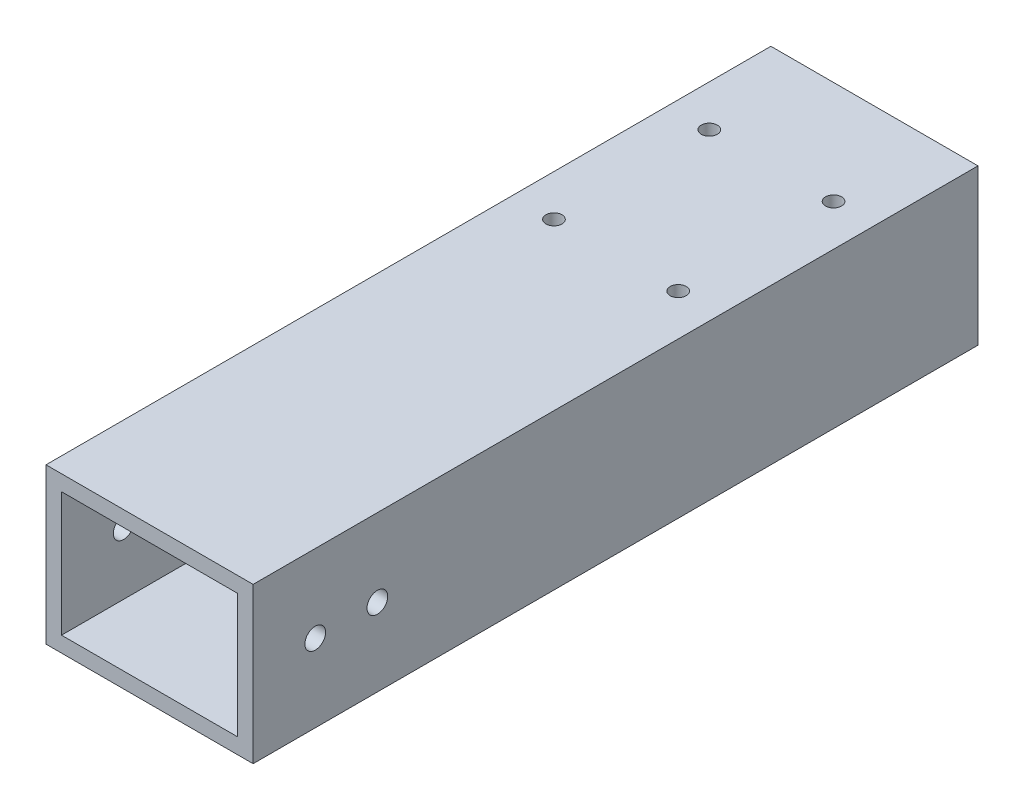
ISO-10303-21;
HEADER;
FILE_DESCRIPTION(('STEP AP214'),'2;1');
FILE_NAME('part.step','',(''),(''),'','','');
FILE_SCHEMA(('AUTOMOTIVE_DESIGN { 1 0 10303 214 1 1 1 1 }'));
ENDSEC;
DATA;
#1=APPLICATION_CONTEXT('core data for automotive mechanical design processes');
#2=APPLICATION_PROTOCOL_DEFINITION('international standard','automotive_design',2000,#1);
#3=PRODUCT_CONTEXT('',#1,'mechanical');
#4=PRODUCT('Part','Part','',(#3));
#5=PRODUCT_RELATED_PRODUCT_CATEGORY('part','',(#4));
#6=PRODUCT_DEFINITION_FORMATION('','',#4);
#7=PRODUCT_DEFINITION_CONTEXT('part definition',#1,'design');
#8=PRODUCT_DEFINITION('design','',#6,#7);
#9=PRODUCT_DEFINITION_SHAPE('','',#8);
#10=(LENGTH_UNIT() NAMED_UNIT(*) SI_UNIT(.MILLI.,.METRE.));
#11=(NAMED_UNIT(*) PLANE_ANGLE_UNIT() SI_UNIT($,.RADIAN.));
#12=(NAMED_UNIT(*) SI_UNIT($,.STERADIAN.) SOLID_ANGLE_UNIT());
#13=UNCERTAINTY_MEASURE_WITH_UNIT(LENGTH_MEASURE(1.E-05),#10,'distance_accuracy_value','');
#14=(GEOMETRIC_REPRESENTATION_CONTEXT(3) GLOBAL_UNCERTAINTY_ASSIGNED_CONTEXT((#13)) GLOBAL_UNIT_ASSIGNED_CONTEXT((#10,
#11,#12)) REPRESENTATION_CONTEXT('',''));
#15=CARTESIAN_POINT('',(0.,0.,0.));
#16=DIRECTION('',(0.,0.,1.));
#17=DIRECTION('',(1.,0.,0.));
#18=AXIS2_PLACEMENT_3D('',#15,#16,#17);
#19=CARTESIAN_POINT('',(0.,0.,140.));
#20=DIRECTION('',(0.,0.,-1.));
#21=DIRECTION('',(-1.,0.,0.));
#22=AXIS2_PLACEMENT_3D('',#19,#20,#21);
#23=PLANE('',#22);
#24=DIRECTION('',(0.,-1.,0.));
#25=VECTOR('',#24,1.);
#26=CARTESIAN_POINT('',(0.,0.,140.));
#27=LINE('',#26,#25);
#28=CARTESIAN_POINT('',(0.,30.,140.));
#29=VERTEX_POINT('',#28);
#30=CARTESIAN_POINT('',(0.,0.,140.));
#31=VERTEX_POINT('',#30);
#32=EDGE_CURVE('E139',#29,#31,#27,.T.);
#33=ORIENTED_EDGE('',*,*,#32,.T.);
#34=DIRECTION('',(1.,0.,0.));
#35=VECTOR('',#34,1.);
#36=CARTESIAN_POINT('',(0.,0.,140.));
#37=LINE('',#36,#35);
#38=CARTESIAN_POINT('',(40.,0.,140.));
#39=VERTEX_POINT('',#38);
#40=EDGE_CURVE('E142',#31,#39,#37,.T.);
#41=ORIENTED_EDGE('',*,*,#40,.T.);
#42=DIRECTION('',(0.,1.,0.));
#43=VECTOR('',#42,1.);
#44=CARTESIAN_POINT('',(40.,0.,140.));
#45=LINE('',#44,#43);
#46=CARTESIAN_POINT('',(40.,30.,140.));
#47=VERTEX_POINT('',#46);
#48=EDGE_CURVE('E145',#39,#47,#45,.T.);
#49=ORIENTED_EDGE('',*,*,#48,.T.);
#50=DIRECTION('',(-1.,0.,0.));
#51=VECTOR('',#50,1.);
#52=CARTESIAN_POINT('',(0.,30.,140.));
#53=LINE('',#52,#51);
#54=EDGE_CURVE('E147',#47,#29,#53,.T.);
#55=ORIENTED_EDGE('',*,*,#54,.T.);
#56=EDGE_LOOP('',(#33,#41,#49,#55));
#57=FACE_BOUND('',#56,.T.);
#58=DIRECTION('',(0.,-1.,0.));
#59=VECTOR('',#58,1.);
#60=CARTESIAN_POINT('',(3.,3.,140.));
#61=LINE('',#60,#59);
#62=CARTESIAN_POINT('',(3.,27.,140.));
#63=VERTEX_POINT('',#62);
#64=CARTESIAN_POINT('',(3.,3.,140.));
#65=VERTEX_POINT('',#64);
#66=EDGE_CURVE('E101',#63,#65,#61,.T.);
#67=ORIENTED_EDGE('',*,*,#66,.F.);
#68=DIRECTION('',(-1.,0.,0.));
#69=VECTOR('',#68,1.);
#70=CARTESIAN_POINT('',(3.,27.,140.));
#71=LINE('',#70,#69);
#72=CARTESIAN_POINT('',(37.,27.,140.));
#73=VERTEX_POINT('',#72);
#74=EDGE_CURVE('E123',#73,#63,#71,.T.);
#75=ORIENTED_EDGE('',*,*,#74,.F.);
#76=DIRECTION('',(0.,1.,0.));
#77=VECTOR('',#76,1.);
#78=CARTESIAN_POINT('',(37.,3.,140.));
#79=LINE('',#78,#77);
#80=CARTESIAN_POINT('',(37.,3.,140.));
#81=VERTEX_POINT('',#80);
#82=EDGE_CURVE('E121',#81,#73,#79,.T.);
#83=ORIENTED_EDGE('',*,*,#82,.F.);
#84=DIRECTION('',(1.,0.,0.));
#85=VECTOR('',#84,1.);
#86=CARTESIAN_POINT('',(3.,3.,140.));
#87=LINE('',#86,#85);
#88=EDGE_CURVE('E109',#65,#81,#87,.T.);
#89=ORIENTED_EDGE('',*,*,#88,.F.);
#90=EDGE_LOOP('',(#67,#75,#83,#89));
#91=FACE_BOUND('',#90,.T.);
#92=ADVANCED_FACE('F34',(#57,#91),#23,.F.);
#93=CARTESIAN_POINT('',(0.,0.,0.));
#94=DIRECTION('',(0.,0.,-1.));
#95=DIRECTION('',(-1.,0.,0.));
#96=AXIS2_PLACEMENT_3D('',#93,#94,#95);
#97=PLANE('',#96);
#98=DIRECTION('',(0.,-1.,0.));
#99=VECTOR('',#98,1.);
#100=CARTESIAN_POINT('',(0.,0.,0.));
#101=LINE('',#100,#99);
#102=CARTESIAN_POINT('',(0.,30.,0.));
#103=VERTEX_POINT('',#102);
#104=CARTESIAN_POINT('',(0.,0.,0.));
#105=VERTEX_POINT('',#104);
#106=EDGE_CURVE('E117',#103,#105,#101,.T.);
#107=ORIENTED_EDGE('',*,*,#106,.F.);
#108=DIRECTION('',(-1.,0.,0.));
#109=VECTOR('',#108,1.);
#110=CARTESIAN_POINT('',(0.,30.,0.));
#111=LINE('',#110,#109);
#112=CARTESIAN_POINT('',(40.,30.,0.));
#113=VERTEX_POINT('',#112);
#114=EDGE_CURVE('E143',#113,#103,#111,.T.);
#115=ORIENTED_EDGE('',*,*,#114,.F.);
#116=DIRECTION('',(0.,1.,0.));
#117=VECTOR('',#116,1.);
#118=CARTESIAN_POINT('',(40.,0.,0.));
#119=LINE('',#118,#117);
#120=CARTESIAN_POINT('',(40.,0.,0.));
#121=VERTEX_POINT('',#120);
#122=EDGE_CURVE('E154',#121,#113,#119,.T.);
#123=ORIENTED_EDGE('',*,*,#122,.F.);
#124=DIRECTION('',(1.,0.,0.));
#125=VECTOR('',#124,1.);
#126=CARTESIAN_POINT('',(0.,0.,0.));
#127=LINE('',#126,#125);
#128=EDGE_CURVE('E152',#105,#121,#127,.T.);
#129=ORIENTED_EDGE('',*,*,#128,.F.);
#130=EDGE_LOOP('',(#107,#115,#123,#129));
#131=FACE_BOUND('',#130,.T.);
#132=DIRECTION('',(-1.,0.,0.));
#133=VECTOR('',#132,1.);
#134=CARTESIAN_POINT('',(3.,27.,0.));
#135=LINE('',#134,#133);
#136=CARTESIAN_POINT('',(37.,27.,0.));
#137=VERTEX_POINT('',#136);
#138=CARTESIAN_POINT('',(3.,27.,0.));
#139=VERTEX_POINT('',#138);
#140=EDGE_CURVE('E110',#137,#139,#135,.T.);
#141=ORIENTED_EDGE('',*,*,#140,.T.);
#142=DIRECTION('',(0.,-1.,0.));
#143=VECTOR('',#142,1.);
#144=CARTESIAN_POINT('',(3.,3.,0.));
#145=LINE('',#144,#143);
#146=CARTESIAN_POINT('',(3.,3.,0.));
#147=VERTEX_POINT('',#146);
#148=EDGE_CURVE('E59',#139,#147,#145,.T.);
#149=ORIENTED_EDGE('',*,*,#148,.T.);
#150=DIRECTION('',(1.,0.,0.));
#151=VECTOR('',#150,1.);
#152=CARTESIAN_POINT('',(3.,3.,0.));
#153=LINE('',#152,#151);
#154=CARTESIAN_POINT('',(37.,3.,0.));
#155=VERTEX_POINT('',#154);
#156=EDGE_CURVE('E116',#147,#155,#153,.T.);
#157=ORIENTED_EDGE('',*,*,#156,.T.);
#158=DIRECTION('',(0.,1.,0.));
#159=VECTOR('',#158,1.);
#160=CARTESIAN_POINT('',(37.,3.,0.));
#161=LINE('',#160,#159);
#162=EDGE_CURVE('E131',#155,#137,#161,.T.);
#163=ORIENTED_EDGE('',*,*,#162,.T.);
#164=EDGE_LOOP('',(#141,#149,#157,#163));
#165=FACE_BOUND('',#164,.T.);
#166=ADVANCED_FACE('F226',(#131,#165),#97,.T.);
#167=CARTESIAN_POINT('',(0.,0.,140.));
#168=DIRECTION('',(1.,0.,0.));
#169=DIRECTION('',(0.,0.,-1.));
#170=AXIS2_PLACEMENT_3D('',#167,#168,#169);
#171=PLANE('',#170);
#172=CARTESIAN_POINT('',(0.,15.,116.));
#173=DIRECTION('',(1.,0.,0.));
#174=DIRECTION('',(0.,0.,-1.));
#175=AXIS2_PLACEMENT_3D('',#172,#173,#174);
#176=CIRCLE('',#175,2.);
#177=CARTESIAN_POINT('',(0.,15.,114.));
#178=VERTEX_POINT('',#177);
#179=EDGE_CURVE('E200',#178,#178,#176,.T.);
#180=ORIENTED_EDGE('',*,*,#179,.T.);
#181=EDGE_LOOP('',(#180));
#182=FACE_BOUND('',#181,.T.);
#183=CARTESIAN_POINT('',(0.,15.,128.));
#184=DIRECTION('',(1.,0.,0.));
#185=DIRECTION('',(0.,0.,-1.));
#186=AXIS2_PLACEMENT_3D('',#183,#184,#185);
#187=CIRCLE('',#186,2.);
#188=CARTESIAN_POINT('',(0.,15.,126.));
#189=VERTEX_POINT('',#188);
#190=EDGE_CURVE('E197',#189,#189,#187,.T.);
#191=ORIENTED_EDGE('',*,*,#190,.T.);
#192=EDGE_LOOP('',(#191));
#193=FACE_BOUND('',#192,.T.);
#194=ORIENTED_EDGE('',*,*,#106,.T.);
#195=DIRECTION('',(0.,0.,-1.));
#196=VECTOR('',#195,1.);
#197=CARTESIAN_POINT('',(0.,0.,140.));
#198=LINE('',#197,#196);
#199=EDGE_CURVE('E11',#31,#105,#198,.T.);
#200=ORIENTED_EDGE('',*,*,#199,.F.);
#201=ORIENTED_EDGE('',*,*,#32,.F.);
#202=DIRECTION('',(0.,0.,-1.));
#203=VECTOR('',#202,1.);
#204=CARTESIAN_POINT('',(0.,30.,140.));
#205=LINE('',#204,#203);
#206=EDGE_CURVE('E149',#29,#103,#205,.T.);
#207=ORIENTED_EDGE('',*,*,#206,.T.);
#208=EDGE_LOOP('',(#194,#200,#201,#207));
#209=FACE_BOUND('',#208,.T.);
#210=ADVANCED_FACE('F36',(#182,#193,#209),#171,.F.);
#211=CARTESIAN_POINT('',(0.,0.,140.));
#212=DIRECTION('',(0.,1.,0.));
#213=DIRECTION('',(0.,0.,1.));
#214=AXIS2_PLACEMENT_3D('',#211,#212,#213);
#215=PLANE('',#214);
#216=CARTESIAN_POINT('',(8.,0.,49.9));
#217=DIRECTION('',(0.,1.,0.));
#218=DIRECTION('',(0.,0.,-1.));
#219=AXIS2_PLACEMENT_3D('',#216,#217,#218);
#220=CIRCLE('',#219,1.55);
#221=CARTESIAN_POINT('',(8.,0.,48.35));
#222=VERTEX_POINT('',#221);
#223=EDGE_CURVE('E335',#222,#222,#220,.T.);
#224=ORIENTED_EDGE('',*,*,#223,.T.);
#225=EDGE_LOOP('',(#224));
#226=FACE_BOUND('',#225,.T.);
#227=CARTESIAN_POINT('',(32.,0.,49.9));
#228=DIRECTION('',(0.,1.,0.));
#229=DIRECTION('',(0.,0.,1.));
#230=AXIS2_PLACEMENT_3D('',#227,#228,#229);
#231=CIRCLE('',#230,1.55);
#232=CARTESIAN_POINT('',(32.,0.,51.45));
#233=VERTEX_POINT('',#232);
#234=EDGE_CURVE('E327',#233,#233,#231,.T.);
#235=ORIENTED_EDGE('',*,*,#234,.T.);
#236=EDGE_LOOP('',(#235));
#237=FACE_BOUND('',#236,.T.);
#238=CARTESIAN_POINT('',(32.,0.,19.9));
#239=DIRECTION('',(0.,1.,0.));
#240=DIRECTION('',(0.,0.,-1.));
#241=AXIS2_PLACEMENT_3D('',#238,#239,#240);
#242=CIRCLE('',#241,1.54999999999999);
#243=CARTESIAN_POINT('',(32.,0.,18.35));
#244=VERTEX_POINT('',#243);
#245=EDGE_CURVE('E318',#244,#244,#242,.T.);
#246=ORIENTED_EDGE('',*,*,#245,.T.);
#247=EDGE_LOOP('',(#246));
#248=FACE_BOUND('',#247,.T.);
#249=CARTESIAN_POINT('',(8.,0.,19.9));
#250=DIRECTION('',(0.,1.,0.));
#251=DIRECTION('',(0.,0.,1.));
#252=AXIS2_PLACEMENT_3D('',#249,#250,#251);
#253=CIRCLE('',#252,1.55);
#254=CARTESIAN_POINT('',(8.,0.,21.45));
#255=VERTEX_POINT('',#254);
#256=EDGE_CURVE('E324',#255,#255,#253,.T.);
#257=ORIENTED_EDGE('',*,*,#256,.T.);
#258=EDGE_LOOP('',(#257));
#259=FACE_BOUND('',#258,.T.);
#260=ORIENTED_EDGE('',*,*,#128,.T.);
#261=DIRECTION('',(0.,0.,-1.));
#262=VECTOR('',#261,1.);
#263=CARTESIAN_POINT('',(40.,0.,140.));
#264=LINE('',#263,#262);
#265=EDGE_CURVE('E43',#39,#121,#264,.T.);
#266=ORIENTED_EDGE('',*,*,#265,.F.);
#267=ORIENTED_EDGE('',*,*,#40,.F.);
#268=ORIENTED_EDGE('',*,*,#199,.T.);
#269=EDGE_LOOP('',(#260,#266,#267,#268));
#270=FACE_BOUND('',#269,.T.);
#271=ADVANCED_FACE('F225',(#226,#237,#248,#259,#270),#215,.F.);
#272=CARTESIAN_POINT('',(40.,0.,140.));
#273=DIRECTION('',(-1.,0.,0.));
#274=DIRECTION('',(0.,0.,1.));
#275=AXIS2_PLACEMENT_3D('',#272,#273,#274);
#276=PLANE('',#275);
#277=CARTESIAN_POINT('',(40.,15.,116.));
#278=DIRECTION('',(1.,0.,0.));
#279=DIRECTION('',(0.,0.,-1.));
#280=AXIS2_PLACEMENT_3D('',#277,#278,#279);
#281=CIRCLE('',#280,2.);
#282=CARTESIAN_POINT('',(40.,15.,114.));
#283=VERTEX_POINT('',#282);
#284=EDGE_CURVE('E168',#283,#283,#281,.T.);
#285=ORIENTED_EDGE('',*,*,#284,.F.);
#286=EDGE_LOOP('',(#285));
#287=FACE_BOUND('',#286,.T.);
#288=CARTESIAN_POINT('',(40.,15.,128.));
#289=DIRECTION('',(1.,0.,0.));
#290=DIRECTION('',(0.,0.,-1.));
#291=AXIS2_PLACEMENT_3D('',#288,#289,#290);
#292=CIRCLE('',#291,2.);
#293=CARTESIAN_POINT('',(40.,15.,126.));
#294=VERTEX_POINT('',#293);
#295=EDGE_CURVE('E203',#294,#294,#292,.T.);
#296=ORIENTED_EDGE('',*,*,#295,.F.);
#297=EDGE_LOOP('',(#296));
#298=FACE_BOUND('',#297,.T.);
#299=ORIENTED_EDGE('',*,*,#122,.T.);
#300=DIRECTION('',(0.,0.,-1.));
#301=VECTOR('',#300,1.);
#302=CARTESIAN_POINT('',(40.,30.,140.));
#303=LINE('',#302,#301);
#304=EDGE_CURVE('E159',#47,#113,#303,.T.);
#305=ORIENTED_EDGE('',*,*,#304,.F.);
#306=ORIENTED_EDGE('',*,*,#48,.F.);
#307=ORIENTED_EDGE('',*,*,#265,.T.);
#308=EDGE_LOOP('',(#299,#305,#306,#307));
#309=FACE_BOUND('',#308,.T.);
#310=ADVANCED_FACE('F246',(#287,#298,#309),#276,.F.);
#311=CARTESIAN_POINT('',(0.,30.,140.));
#312=DIRECTION('',(0.,-1.,0.));
#313=DIRECTION('',(0.,0.,-1.));
#314=AXIS2_PLACEMENT_3D('',#311,#312,#313);
#315=PLANE('',#314);
#316=CARTESIAN_POINT('',(8.,30.,49.9));
#317=DIRECTION('',(0.,1.,0.));
#318=DIRECTION('',(0.,0.,-1.));
#319=AXIS2_PLACEMENT_3D('',#316,#317,#318);
#320=CIRCLE('',#319,1.55);
#321=CARTESIAN_POINT('',(8.,30.,48.35));
#322=VERTEX_POINT('',#321);
#323=EDGE_CURVE('E332',#322,#322,#320,.T.);
#324=ORIENTED_EDGE('',*,*,#323,.F.);
#325=EDGE_LOOP('',(#324));
#326=FACE_BOUND('',#325,.T.);
#327=CARTESIAN_POINT('',(32.,30.,49.9));
#328=DIRECTION('',(0.,1.,0.));
#329=DIRECTION('',(0.,0.,1.));
#330=AXIS2_PLACEMENT_3D('',#327,#328,#329);
#331=CIRCLE('',#330,1.55);
#332=CARTESIAN_POINT('',(32.,30.,51.45));
#333=VERTEX_POINT('',#332);
#334=EDGE_CURVE('E321',#333,#333,#331,.T.);
#335=ORIENTED_EDGE('',*,*,#334,.F.);
#336=EDGE_LOOP('',(#335));
#337=FACE_BOUND('',#336,.T.);
#338=CARTESIAN_POINT('',(32.,30.,19.9));
#339=DIRECTION('',(0.,1.,0.));
#340=DIRECTION('',(0.,0.,-1.));
#341=AXIS2_PLACEMENT_3D('',#338,#339,#340);
#342=CIRCLE('',#341,1.54999999999999);
#343=CARTESIAN_POINT('',(32.,30.,18.35));
#344=VERTEX_POINT('',#343);
#345=EDGE_CURVE('E320',#344,#344,#342,.T.);
#346=ORIENTED_EDGE('',*,*,#345,.F.);
#347=EDGE_LOOP('',(#346));
#348=FACE_BOUND('',#347,.T.);
#349=CARTESIAN_POINT('',(8.,30.,19.9));
#350=DIRECTION('',(0.,1.,0.));
#351=DIRECTION('',(0.,0.,1.));
#352=AXIS2_PLACEMENT_3D('',#349,#350,#351);
#353=CIRCLE('',#352,1.55);
#354=CARTESIAN_POINT('',(8.,30.,21.45));
#355=VERTEX_POINT('',#354);
#356=EDGE_CURVE('E176',#355,#355,#353,.T.);
#357=ORIENTED_EDGE('',*,*,#356,.F.);
#358=EDGE_LOOP('',(#357));
#359=FACE_BOUND('',#358,.T.);
#360=ORIENTED_EDGE('',*,*,#114,.T.);
#361=ORIENTED_EDGE('',*,*,#206,.F.);
#362=ORIENTED_EDGE('',*,*,#54,.F.);
#363=ORIENTED_EDGE('',*,*,#304,.T.);
#364=EDGE_LOOP('',(#360,#361,#362,#363));
#365=FACE_BOUND('',#364,.T.);
#366=ADVANCED_FACE('F244',(#326,#337,#348,#359,#365),#315,.F.);
#367=CARTESIAN_POINT('',(3.,3.,140.));
#368=DIRECTION('',(1.,0.,0.));
#369=DIRECTION('',(0.,0.,-1.));
#370=AXIS2_PLACEMENT_3D('',#367,#368,#369);
#371=PLANE('',#370);
#372=CARTESIAN_POINT('',(3.,15.,116.));
#373=DIRECTION('',(1.,0.,0.));
#374=DIRECTION('',(0.,0.,-1.));
#375=AXIS2_PLACEMENT_3D('',#372,#373,#374);
#376=CIRCLE('',#375,2.);
#377=CARTESIAN_POINT('',(3.,15.,114.));
#378=VERTEX_POINT('',#377);
#379=EDGE_CURVE('E129',#378,#378,#376,.F.);
#380=ORIENTED_EDGE('',*,*,#379,.T.);
#381=EDGE_LOOP('',(#380));
#382=FACE_BOUND('',#381,.T.);
#383=CARTESIAN_POINT('',(3.,15.,128.));
#384=DIRECTION('',(1.,0.,0.));
#385=DIRECTION('',(0.,0.,-1.));
#386=AXIS2_PLACEMENT_3D('',#383,#384,#385);
#387=CIRCLE('',#386,2.);
#388=CARTESIAN_POINT('',(3.,15.,126.));
#389=VERTEX_POINT('',#388);
#390=EDGE_CURVE('E167',#389,#389,#387,.F.);
#391=ORIENTED_EDGE('',*,*,#390,.T.);
#392=EDGE_LOOP('',(#391));
#393=FACE_BOUND('',#392,.T.);
#394=ORIENTED_EDGE('',*,*,#148,.F.);
#395=DIRECTION('',(0.,0.,-1.));
#396=VECTOR('',#395,1.);
#397=CARTESIAN_POINT('',(3.,27.,140.));
#398=LINE('',#397,#396);
#399=EDGE_CURVE('E105',#63,#139,#398,.T.);
#400=ORIENTED_EDGE('',*,*,#399,.F.);
#401=ORIENTED_EDGE('',*,*,#66,.T.);
#402=DIRECTION('',(0.,0.,-1.));
#403=VECTOR('',#402,1.);
#404=CARTESIAN_POINT('',(3.,3.,140.));
#405=LINE('',#404,#403);
#406=EDGE_CURVE('E104',#65,#147,#405,.T.);
#407=ORIENTED_EDGE('',*,*,#406,.T.);
#408=EDGE_LOOP('',(#394,#400,#401,#407));
#409=FACE_BOUND('',#408,.T.);
#410=ADVANCED_FACE('F103',(#382,#393,#409),#371,.T.);
#411=CARTESIAN_POINT('',(3.,3.,140.));
#412=DIRECTION('',(0.,1.,0.));
#413=DIRECTION('',(0.,0.,1.));
#414=AXIS2_PLACEMENT_3D('',#411,#412,#413);
#415=PLANE('',#414);
#416=CARTESIAN_POINT('',(8.,3.,49.9));
#417=DIRECTION('',(0.,1.,0.));
#418=DIRECTION('',(0.,0.,1.));
#419=AXIS2_PLACEMENT_3D('',#416,#417,#418);
#420=CIRCLE('',#419,1.55);
#421=CARTESIAN_POINT('',(8.,3.,51.45));
#422=VERTEX_POINT('',#421);
#423=EDGE_CURVE('E194',#422,#422,#420,.F.);
#424=ORIENTED_EDGE('',*,*,#423,.T.);
#425=EDGE_LOOP('',(#424));
#426=FACE_BOUND('',#425,.T.);
#427=CARTESIAN_POINT('',(32.,3.,49.9));
#428=DIRECTION('',(0.,1.,0.));
#429=DIRECTION('',(0.,0.,1.));
#430=AXIS2_PLACEMENT_3D('',#427,#428,#429);
#431=CIRCLE('',#430,1.55);
#432=CARTESIAN_POINT('',(32.,3.,51.45));
#433=VERTEX_POINT('',#432);
#434=EDGE_CURVE('E182',#433,#433,#431,.F.);
#435=ORIENTED_EDGE('',*,*,#434,.T.);
#436=EDGE_LOOP('',(#435));
#437=FACE_BOUND('',#436,.T.);
#438=CARTESIAN_POINT('',(32.,3.,19.9));
#439=DIRECTION('',(0.,1.,0.));
#440=DIRECTION('',(0.,0.,1.));
#441=AXIS2_PLACEMENT_3D('',#438,#439,#440);
#442=CIRCLE('',#441,1.54999999999999);
#443=CARTESIAN_POINT('',(32.,3.,21.45));
#444=VERTEX_POINT('',#443);
#445=EDGE_CURVE('E179',#444,#444,#442,.F.);
#446=ORIENTED_EDGE('',*,*,#445,.T.);
#447=EDGE_LOOP('',(#446));
#448=FACE_BOUND('',#447,.T.);
#449=CARTESIAN_POINT('',(8.,3.,19.9));
#450=DIRECTION('',(0.,1.,0.));
#451=DIRECTION('',(0.,0.,1.));
#452=AXIS2_PLACEMENT_3D('',#449,#450,#451);
#453=CIRCLE('',#452,1.55);
#454=CARTESIAN_POINT('',(8.,3.,21.45));
#455=VERTEX_POINT('',#454);
#456=EDGE_CURVE('E175',#455,#455,#453,.F.);
#457=ORIENTED_EDGE('',*,*,#456,.T.);
#458=EDGE_LOOP('',(#457));
#459=FACE_BOUND('',#458,.T.);
#460=ORIENTED_EDGE('',*,*,#156,.F.);
#461=ORIENTED_EDGE('',*,*,#406,.F.);
#462=ORIENTED_EDGE('',*,*,#88,.T.);
#463=DIRECTION('',(0.,0.,-1.));
#464=VECTOR('',#463,1.);
#465=CARTESIAN_POINT('',(37.,3.,140.));
#466=LINE('',#465,#464);
#467=EDGE_CURVE('E118',#81,#155,#466,.T.);
#468=ORIENTED_EDGE('',*,*,#467,.T.);
#469=EDGE_LOOP('',(#460,#461,#462,#468));
#470=FACE_BOUND('',#469,.T.);
#471=ADVANCED_FACE('F113',(#426,#437,#448,#459,#470),#415,.T.);
#472=CARTESIAN_POINT('',(37.,3.,140.));
#473=DIRECTION('',(-1.,0.,0.));
#474=DIRECTION('',(0.,0.,1.));
#475=AXIS2_PLACEMENT_3D('',#472,#473,#474);
#476=PLANE('',#475);
#477=CARTESIAN_POINT('',(37.,15.,116.));
#478=DIRECTION('',(-1.,0.,0.));
#479=DIRECTION('',(0.,0.,1.));
#480=AXIS2_PLACEMENT_3D('',#477,#478,#479);
#481=CIRCLE('',#480,2.);
#482=CARTESIAN_POINT('',(37.,15.,118.));
#483=VERTEX_POINT('',#482);
#484=EDGE_CURVE('E169',#483,#483,#481,.F.);
#485=ORIENTED_EDGE('',*,*,#484,.T.);
#486=EDGE_LOOP('',(#485));
#487=FACE_BOUND('',#486,.T.);
#488=CARTESIAN_POINT('',(37.,15.,128.));
#489=DIRECTION('',(-1.,0.,0.));
#490=DIRECTION('',(0.,0.,1.));
#491=AXIS2_PLACEMENT_3D('',#488,#489,#490);
#492=CIRCLE('',#491,2.);
#493=CARTESIAN_POINT('',(37.,15.,130.));
#494=VERTEX_POINT('',#493);
#495=EDGE_CURVE('E164',#494,#494,#492,.F.);
#496=ORIENTED_EDGE('',*,*,#495,.T.);
#497=EDGE_LOOP('',(#496));
#498=FACE_BOUND('',#497,.T.);
#499=ORIENTED_EDGE('',*,*,#162,.F.);
#500=ORIENTED_EDGE('',*,*,#467,.F.);
#501=ORIENTED_EDGE('',*,*,#82,.T.);
#502=DIRECTION('',(0.,0.,-1.));
#503=VECTOR('',#502,1.);
#504=CARTESIAN_POINT('',(37.,27.,140.));
#505=LINE('',#504,#503);
#506=EDGE_CURVE('E51',#73,#137,#505,.T.);
#507=ORIENTED_EDGE('',*,*,#506,.T.);
#508=EDGE_LOOP('',(#499,#500,#501,#507));
#509=FACE_BOUND('',#508,.T.);
#510=ADVANCED_FACE('F270',(#487,#498,#509),#476,.T.);
#511=CARTESIAN_POINT('',(3.,27.,140.));
#512=DIRECTION('',(0.,-1.,0.));
#513=DIRECTION('',(0.,0.,-1.));
#514=AXIS2_PLACEMENT_3D('',#511,#512,#513);
#515=PLANE('',#514);
#516=CARTESIAN_POINT('',(8.,27.,49.9));
#517=DIRECTION('',(0.,-1.,0.));
#518=DIRECTION('',(0.,0.,-1.));
#519=AXIS2_PLACEMENT_3D('',#516,#517,#518);
#520=CIRCLE('',#519,1.55);
#521=CARTESIAN_POINT('',(8.,27.,48.35));
#522=VERTEX_POINT('',#521);
#523=EDGE_CURVE('E38',#522,#522,#520,.F.);
#524=ORIENTED_EDGE('',*,*,#523,.T.);
#525=EDGE_LOOP('',(#524));
#526=FACE_BOUND('',#525,.T.);
#527=CARTESIAN_POINT('',(32.,27.,49.9));
#528=DIRECTION('',(0.,-1.,0.));
#529=DIRECTION('',(0.,0.,-1.));
#530=AXIS2_PLACEMENT_3D('',#527,#528,#529);
#531=CIRCLE('',#530,1.55);
#532=CARTESIAN_POINT('',(32.,27.,48.35));
#533=VERTEX_POINT('',#532);
#534=EDGE_CURVE('E180',#533,#533,#531,.F.);
#535=ORIENTED_EDGE('',*,*,#534,.T.);
#536=EDGE_LOOP('',(#535));
#537=FACE_BOUND('',#536,.T.);
#538=CARTESIAN_POINT('',(32.,27.,19.9));
#539=DIRECTION('',(0.,-1.,0.));
#540=DIRECTION('',(0.,0.,-1.));
#541=AXIS2_PLACEMENT_3D('',#538,#539,#540);
#542=CIRCLE('',#541,1.54999999999999);
#543=CARTESIAN_POINT('',(32.,27.,18.35));
#544=VERTEX_POINT('',#543);
#545=EDGE_CURVE('E177',#544,#544,#542,.F.);
#546=ORIENTED_EDGE('',*,*,#545,.T.);
#547=EDGE_LOOP('',(#546));
#548=FACE_BOUND('',#547,.T.);
#549=CARTESIAN_POINT('',(8.,27.,19.9));
#550=DIRECTION('',(0.,-1.,0.));
#551=DIRECTION('',(0.,0.,-1.));
#552=AXIS2_PLACEMENT_3D('',#549,#550,#551);
#553=CIRCLE('',#552,1.55);
#554=CARTESIAN_POINT('',(8.,27.,18.35));
#555=VERTEX_POINT('',#554);
#556=EDGE_CURVE('E172',#555,#555,#553,.F.);
#557=ORIENTED_EDGE('',*,*,#556,.T.);
#558=EDGE_LOOP('',(#557));
#559=FACE_BOUND('',#558,.T.);
#560=ORIENTED_EDGE('',*,*,#140,.F.);
#561=ORIENTED_EDGE('',*,*,#506,.F.);
#562=ORIENTED_EDGE('',*,*,#74,.T.);
#563=ORIENTED_EDGE('',*,*,#399,.T.);
#564=EDGE_LOOP('',(#560,#561,#562,#563));
#565=FACE_BOUND('',#564,.T.);
#566=ADVANCED_FACE('F274',(#526,#537,#548,#559,#565),#515,.T.);
#567=CARTESIAN_POINT('',(40.,15.,128.));
#568=DIRECTION('',(-1.,0.,0.));
#569=DIRECTION('',(0.,0.,1.));
#570=AXIS2_PLACEMENT_3D('',#567,#568,#569);
#571=CYLINDRICAL_SURFACE('',#570,2.);
#572=ORIENTED_EDGE('',*,*,#495,.F.);
#573=EDGE_LOOP('',(#572));
#574=FACE_BOUND('',#573,.T.);
#575=ORIENTED_EDGE('',*,*,#295,.T.);
#576=EDGE_LOOP('',(#575));
#577=FACE_BOUND('',#576,.T.);
#578=ADVANCED_FACE('F278',(#574,#577),#571,.F.);
#579=CARTESIAN_POINT('',(40.,15.,116.));
#580=DIRECTION('',(-1.,0.,0.));
#581=DIRECTION('',(0.,0.,1.));
#582=AXIS2_PLACEMENT_3D('',#579,#580,#581);
#583=CYLINDRICAL_SURFACE('',#582,2.);
#584=ORIENTED_EDGE('',*,*,#484,.F.);
#585=EDGE_LOOP('',(#584));
#586=FACE_BOUND('',#585,.T.);
#587=ORIENTED_EDGE('',*,*,#284,.T.);
#588=EDGE_LOOP('',(#587));
#589=FACE_BOUND('',#588,.T.);
#590=ADVANCED_FACE('F220',(#586,#589),#583,.F.);
#591=ORIENTED_EDGE('',*,*,#390,.F.);
#592=EDGE_LOOP('',(#591));
#593=FACE_BOUND('',#592,.T.);
#594=ORIENTED_EDGE('',*,*,#190,.F.);
#595=EDGE_LOOP('',(#594));
#596=FACE_BOUND('',#595,.T.);
#597=ADVANCED_FACE('F218',(#593,#596),#571,.F.);
#598=ORIENTED_EDGE('',*,*,#379,.F.);
#599=EDGE_LOOP('',(#598));
#600=FACE_BOUND('',#599,.T.);
#601=ORIENTED_EDGE('',*,*,#179,.F.);
#602=EDGE_LOOP('',(#601));
#603=FACE_BOUND('',#602,.T.);
#604=ADVANCED_FACE('F214',(#600,#603),#583,.F.);
#605=CARTESIAN_POINT('',(8.,30.,19.9));
#606=DIRECTION('',(0.,-1.,0.));
#607=DIRECTION('',(0.,0.,-1.));
#608=AXIS2_PLACEMENT_3D('',#605,#606,#607);
#609=CYLINDRICAL_SURFACE('',#608,1.55);
#610=ORIENTED_EDGE('',*,*,#556,.F.);
#611=EDGE_LOOP('',(#610));
#612=FACE_BOUND('',#611,.T.);
#613=ORIENTED_EDGE('',*,*,#356,.T.);
#614=EDGE_LOOP('',(#613));
#615=FACE_BOUND('',#614,.T.);
#616=ADVANCED_FACE('F217',(#612,#615),#609,.F.);
#617=CARTESIAN_POINT('',(32.,30.,19.9));
#618=DIRECTION('',(0.,-1.,0.));
#619=DIRECTION('',(0.,0.,-1.));
#620=AXIS2_PLACEMENT_3D('',#617,#618,#619);
#621=CYLINDRICAL_SURFACE('',#620,1.54999999999999);
#622=ORIENTED_EDGE('',*,*,#545,.F.);
#623=EDGE_LOOP('',(#622));
#624=FACE_BOUND('',#623,.T.);
#625=ORIENTED_EDGE('',*,*,#345,.T.);
#626=EDGE_LOOP('',(#625));
#627=FACE_BOUND('',#626,.T.);
#628=ADVANCED_FACE('F287',(#624,#627),#621,.F.);
#629=CARTESIAN_POINT('',(32.,30.,49.9));
#630=DIRECTION('',(0.,-1.,0.));
#631=DIRECTION('',(0.,0.,-1.));
#632=AXIS2_PLACEMENT_3D('',#629,#630,#631);
#633=CYLINDRICAL_SURFACE('',#632,1.55);
#634=ORIENTED_EDGE('',*,*,#534,.F.);
#635=EDGE_LOOP('',(#634));
#636=FACE_BOUND('',#635,.T.);
#637=ORIENTED_EDGE('',*,*,#334,.T.);
#638=EDGE_LOOP('',(#637));
#639=FACE_BOUND('',#638,.T.);
#640=ADVANCED_FACE('F293',(#636,#639),#633,.F.);
#641=CARTESIAN_POINT('',(8.,30.,49.9));
#642=DIRECTION('',(0.,-1.,0.));
#643=DIRECTION('',(0.,0.,-1.));
#644=AXIS2_PLACEMENT_3D('',#641,#642,#643);
#645=CYLINDRICAL_SURFACE('',#644,1.55);
#646=ORIENTED_EDGE('',*,*,#523,.F.);
#647=EDGE_LOOP('',(#646));
#648=FACE_BOUND('',#647,.T.);
#649=ORIENTED_EDGE('',*,*,#323,.T.);
#650=EDGE_LOOP('',(#649));
#651=FACE_BOUND('',#650,.T.);
#652=ADVANCED_FACE('F290',(#648,#651),#645,.F.);
#653=ORIENTED_EDGE('',*,*,#456,.F.);
#654=EDGE_LOOP('',(#653));
#655=FACE_BOUND('',#654,.T.);
#656=ORIENTED_EDGE('',*,*,#256,.F.);
#657=EDGE_LOOP('',(#656));
#658=FACE_BOUND('',#657,.T.);
#659=ADVANCED_FACE('F289',(#655,#658),#609,.F.);
#660=ORIENTED_EDGE('',*,*,#445,.F.);
#661=EDGE_LOOP('',(#660));
#662=FACE_BOUND('',#661,.T.);
#663=ORIENTED_EDGE('',*,*,#245,.F.);
#664=EDGE_LOOP('',(#663));
#665=FACE_BOUND('',#664,.T.);
#666=ADVANCED_FACE('F302',(#662,#665),#621,.F.);
#667=ORIENTED_EDGE('',*,*,#434,.F.);
#668=EDGE_LOOP('',(#667));
#669=FACE_BOUND('',#668,.T.);
#670=ORIENTED_EDGE('',*,*,#234,.F.);
#671=EDGE_LOOP('',(#670));
#672=FACE_BOUND('',#671,.T.);
#673=ADVANCED_FACE('F299',(#669,#672),#633,.F.);
#674=ORIENTED_EDGE('',*,*,#423,.F.);
#675=EDGE_LOOP('',(#674));
#676=FACE_BOUND('',#675,.T.);
#677=ORIENTED_EDGE('',*,*,#223,.F.);
#678=EDGE_LOOP('',(#677));
#679=FACE_BOUND('',#678,.T.);
#680=ADVANCED_FACE('F295',(#676,#679),#645,.F.);
#681=CLOSED_SHELL('',(#92,#166,#210,#271,#310,#366,#410,#471,#510,#566,#578,#590,#597,#604,#616,
#628,#640,#652,#659,#666,#673,#680));
#682=MANIFOLD_SOLID_BREP('B2',#681);
#683=ADVANCED_BREP_SHAPE_REPRESENTATION('',(#18,#682),#14);
#684=SHAPE_DEFINITION_REPRESENTATION(#9,#683);
ENDSEC;
END-ISO-10303-21;
